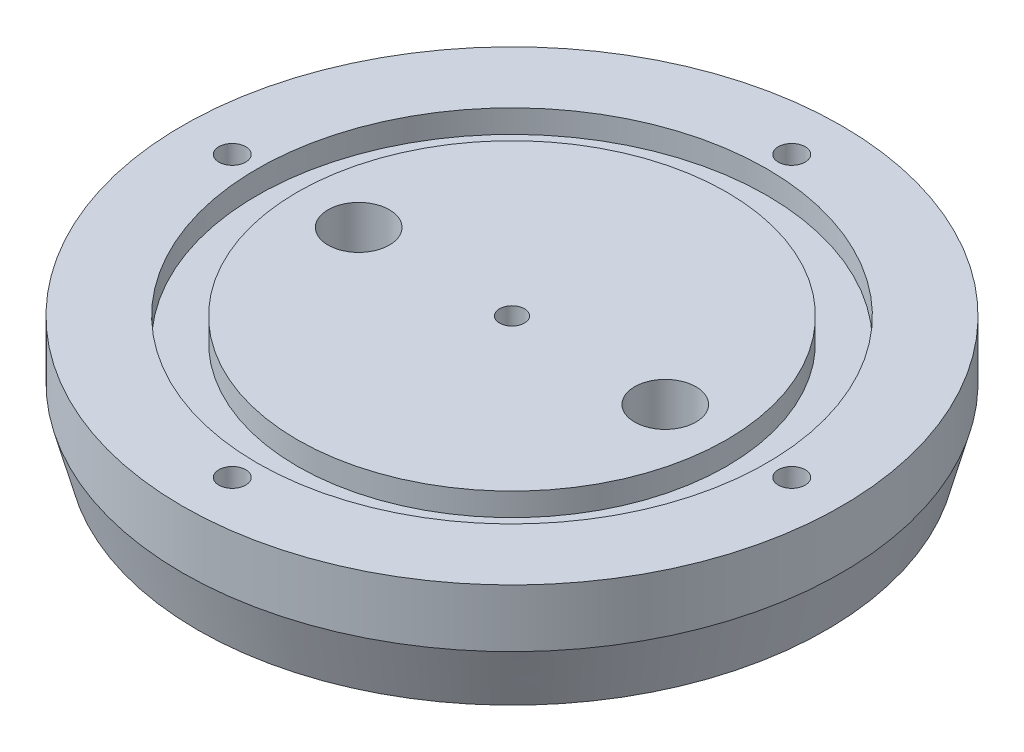
ISO-10303-21;
HEADER;
FILE_DESCRIPTION(('STEP AP214'),'2;1');
FILE_NAME('part.step','',(''),(''),'','','');
FILE_SCHEMA(('AUTOMOTIVE_DESIGN { 1 0 10303 214 1 1 1 1 }'));
ENDSEC;
DATA;
#1=APPLICATION_CONTEXT('core data for automotive mechanical design processes');
#2=APPLICATION_PROTOCOL_DEFINITION('international standard','automotive_design',2000,#1);
#3=PRODUCT_CONTEXT('',#1,'mechanical');
#4=PRODUCT('Part','Part','',(#3));
#5=PRODUCT_RELATED_PRODUCT_CATEGORY('part','',(#4));
#6=PRODUCT_DEFINITION_FORMATION('','',#4);
#7=PRODUCT_DEFINITION_CONTEXT('part definition',#1,'design');
#8=PRODUCT_DEFINITION('design','',#6,#7);
#9=PRODUCT_DEFINITION_SHAPE('','',#8);
#10=(LENGTH_UNIT() NAMED_UNIT(*) SI_UNIT(.MILLI.,.METRE.));
#11=(NAMED_UNIT(*) PLANE_ANGLE_UNIT() SI_UNIT($,.RADIAN.));
#12=(NAMED_UNIT(*) SI_UNIT($,.STERADIAN.) SOLID_ANGLE_UNIT());
#13=UNCERTAINTY_MEASURE_WITH_UNIT(LENGTH_MEASURE(1.E-05),#10,'distance_accuracy_value','');
#14=(GEOMETRIC_REPRESENTATION_CONTEXT(3) GLOBAL_UNCERTAINTY_ASSIGNED_CONTEXT((#13)) GLOBAL_UNIT_ASSIGNED_CONTEXT((#10,
#11,#12)) REPRESENTATION_CONTEXT('',''));
#15=CARTESIAN_POINT('',(0.,0.,0.));
#16=DIRECTION('',(0.,0.,1.));
#17=DIRECTION('',(1.,0.,0.));
#18=AXIS2_PLACEMENT_3D('',#15,#16,#17);
#19=CARTESIAN_POINT('',(0.,15.,0.));
#20=DIRECTION('',(0.,1.,0.));
#21=DIRECTION('',(0.,0.,1.));
#22=AXIS2_PLACEMENT_3D('',#19,#20,#21);
#23=PLANE('',#22);
#24=CARTESIAN_POINT('',(20.,15.,0.));
#25=DIRECTION('',(0.,-1.,0.));
#26=DIRECTION('',(0.,0.,-1.));
#27=AXIS2_PLACEMENT_3D('',#24,#25,#26);
#28=CIRCLE('',#27,4.);
#29=CARTESIAN_POINT('',(20.,15.,-4.));
#30=VERTEX_POINT('',#29);
#31=EDGE_CURVE('E66',#30,#30,#28,.T.);
#32=ORIENTED_EDGE('',*,*,#31,.T.);
#33=EDGE_LOOP('',(#32));
#34=FACE_BOUND('',#33,.T.);
#35=CARTESIAN_POINT('',(-20.,15.,0.));
#36=DIRECTION('',(0.,-1.,0.));
#37=DIRECTION('',(0.,0.,-1.));
#38=AXIS2_PLACEMENT_3D('',#35,#36,#37);
#39=CIRCLE('',#38,4.);
#40=CARTESIAN_POINT('',(-20.,15.,-4.));
#41=VERTEX_POINT('',#40);
#42=EDGE_CURVE('E69',#41,#41,#39,.T.);
#43=ORIENTED_EDGE('',*,*,#42,.T.);
#44=EDGE_LOOP('',(#43));
#45=FACE_BOUND('',#44,.T.);
#46=CARTESIAN_POINT('',(0.,15.,0.));
#47=DIRECTION('',(0.,1.,0.));
#48=DIRECTION('',(0.,0.,1.));
#49=AXIS2_PLACEMENT_3D('',#46,#47,#48);
#50=CIRCLE('',#49,1.625);
#51=CARTESIAN_POINT('',(0.,15.,1.625));
#52=VERTEX_POINT('',#51);
#53=EDGE_CURVE('E72',#52,#52,#50,.T.);
#54=ORIENTED_EDGE('',*,*,#53,.F.);
#55=EDGE_LOOP('',(#54));
#56=FACE_BOUND('',#55,.T.);
#57=CARTESIAN_POINT('',(0.,15.,0.));
#58=DIRECTION('',(0.,1.,0.));
#59=DIRECTION('',(0.,0.,1.));
#60=AXIS2_PLACEMENT_3D('',#57,#58,#59);
#61=CIRCLE('',#60,28.);
#62=CARTESIAN_POINT('',(0.,15.,28.));
#63=VERTEX_POINT('',#62);
#64=EDGE_CURVE('E82',#63,#63,#61,.T.);
#65=ORIENTED_EDGE('',*,*,#64,.T.);
#66=EDGE_LOOP('',(#65));
#67=FACE_BOUND('',#66,.T.);
#68=ADVANCED_FACE('F31',(#34,#45,#56,#67),#23,.T.);
#69=CARTESIAN_POINT('',(0.,15.,0.));
#70=DIRECTION('',(0.,-1.,0.));
#71=DIRECTION('',(0.,0.,-1.));
#72=AXIS2_PLACEMENT_3D('',#69,#70,#71);
#73=CYLINDRICAL_SURFACE('',#72,43.);
#74=CARTESIAN_POINT('',(0.,7.46410161513783,0.));
#75=DIRECTION('',(0.,1.,0.));
#76=DIRECTION('',(0.,0.,1.));
#77=AXIS2_PLACEMENT_3D('',#74,#75,#76);
#78=CIRCLE('',#77,43.);
#79=CARTESIAN_POINT('',(0.,7.46410161513783,43.));
#80=VERTEX_POINT('',#79);
#81=EDGE_CURVE('E60',#80,#80,#78,.T.);
#82=ORIENTED_EDGE('',*,*,#81,.T.);
#83=EDGE_LOOP('',(#82));
#84=FACE_BOUND('',#83,.T.);
#85=CARTESIAN_POINT('',(0.,15.,0.));
#86=DIRECTION('',(0.,1.,0.));
#87=DIRECTION('',(0.,0.,1.));
#88=AXIS2_PLACEMENT_3D('',#85,#86,#87);
#89=CIRCLE('',#88,43.);
#90=CARTESIAN_POINT('',(0.,15.,43.));
#91=VERTEX_POINT('',#90);
#92=EDGE_CURVE('E63',#91,#91,#89,.T.);
#93=ORIENTED_EDGE('',*,*,#92,.F.);
#94=EDGE_LOOP('',(#93));
#95=FACE_BOUND('',#94,.T.);
#96=ADVANCED_FACE('F152',(#84,#95),#73,.T.);
#97=CARTESIAN_POINT('',(-36.5,15.,0.));
#98=DIRECTION('',(0.,-1.,0.));
#99=DIRECTION('',(0.,0.,1.));
#100=AXIS2_PLACEMENT_3D('',#97,#98,#99);
#101=CIRCLE('',#100,1.75);
#102=CARTESIAN_POINT('',(-36.5,15.,1.75));
#103=VERTEX_POINT('',#102);
#104=EDGE_CURVE('E97',#103,#103,#101,.T.);
#105=ORIENTED_EDGE('',*,*,#104,.T.);
#106=EDGE_LOOP('',(#105));
#107=FACE_BOUND('',#106,.T.);
#108=CARTESIAN_POINT('',(3.82317206603323E-13,15.,-36.5));
#109=DIRECTION('',(0.,-1.,0.));
#110=DIRECTION('',(-1.,0.,0.));
#111=AXIS2_PLACEMENT_3D('',#108,#109,#110);
#112=CIRCLE('',#111,1.75);
#113=CARTESIAN_POINT('',(-1.74999999999962,15.,-36.5));
#114=VERTEX_POINT('',#113);
#115=EDGE_CURVE('E103',#114,#114,#112,.T.);
#116=ORIENTED_EDGE('',*,*,#115,.T.);
#117=EDGE_LOOP('',(#116));
#118=FACE_BOUND('',#117,.T.);
#119=CARTESIAN_POINT('',(-1.27439068867774E-13,15.,36.5));
#120=DIRECTION('',(0.,-1.,0.));
#121=DIRECTION('',(1.,0.,0.));
#122=AXIS2_PLACEMENT_3D('',#119,#120,#121);
#123=CIRCLE('',#122,1.75);
#124=CARTESIAN_POINT('',(1.74999999999988,15.,36.5));
#125=VERTEX_POINT('',#124);
#126=EDGE_CURVE('E91',#125,#125,#123,.T.);
#127=ORIENTED_EDGE('',*,*,#126,.T.);
#128=EDGE_LOOP('',(#127));
#129=FACE_BOUND('',#128,.T.);
#130=CARTESIAN_POINT('',(36.5,15.,0.));
#131=DIRECTION('',(0.,-1.,0.));
#132=DIRECTION('',(0.,0.,-1.));
#133=AXIS2_PLACEMENT_3D('',#130,#131,#132);
#134=CIRCLE('',#133,1.75);
#135=CARTESIAN_POINT('',(36.5,15.,-1.75));
#136=VERTEX_POINT('',#135);
#137=EDGE_CURVE('E85',#136,#136,#134,.T.);
#138=ORIENTED_EDGE('',*,*,#137,.T.);
#139=EDGE_LOOP('',(#138));
#140=FACE_BOUND('',#139,.T.);
#141=CARTESIAN_POINT('',(0.,15.,0.));
#142=DIRECTION('',(0.,1.,0.));
#143=DIRECTION('',(0.,0.,1.));
#144=AXIS2_PLACEMENT_3D('',#141,#142,#143);
#145=CIRCLE('',#144,33.25);
#146=CARTESIAN_POINT('',(0.,15.,33.25));
#147=VERTEX_POINT('',#146);
#148=EDGE_CURVE('E76',#147,#147,#145,.T.);
#149=ORIENTED_EDGE('',*,*,#148,.F.);
#150=EDGE_LOOP('',(#149));
#151=FACE_BOUND('',#150,.T.);
#152=ORIENTED_EDGE('',*,*,#92,.T.);
#153=EDGE_LOOP('',(#152));
#154=FACE_BOUND('',#153,.T.);
#155=ADVANCED_FACE('F112',(#107,#118,#129,#140,#151,#154),#23,.T.);
#156=CARTESIAN_POINT('',(0.,0.,0.));
#157=DIRECTION('',(0.,1.,0.));
#158=DIRECTION('',(0.,0.,1.));
#159=AXIS2_PLACEMENT_3D('',#156,#157,#158);
#160=PLANE('',#159);
#161=CARTESIAN_POINT('',(20.,0.,0.));
#162=DIRECTION('',(0.,1.,0.));
#163=DIRECTION('',(0.,0.,1.));
#164=AXIS2_PLACEMENT_3D('',#161,#162,#163);
#165=CIRCLE('',#164,4.49999999999998);
#166=CARTESIAN_POINT('',(20.,0.,4.49999999999998));
#167=VERTEX_POINT('',#166);
#168=EDGE_CURVE('E42',#167,#167,#165,.T.);
#169=ORIENTED_EDGE('',*,*,#168,.T.);
#170=EDGE_LOOP('',(#169));
#171=FACE_BOUND('',#170,.T.);
#172=CARTESIAN_POINT('',(0.,0.,0.));
#173=DIRECTION('',(0.,1.,0.));
#174=DIRECTION('',(0.,0.,1.));
#175=AXIS2_PLACEMENT_3D('',#172,#173,#174);
#176=CIRCLE('',#175,2.12499999999999);
#177=CARTESIAN_POINT('',(0.,0.,2.12499999999999));
#178=VERTEX_POINT('',#177);
#179=EDGE_CURVE('E46',#178,#178,#176,.T.);
#180=ORIENTED_EDGE('',*,*,#179,.T.);
#181=EDGE_LOOP('',(#180));
#182=FACE_BOUND('',#181,.T.);
#183=CARTESIAN_POINT('',(-20.,0.,0.));
#184=DIRECTION('',(0.,1.,0.));
#185=DIRECTION('',(0.,0.,1.));
#186=AXIS2_PLACEMENT_3D('',#183,#184,#185);
#187=CIRCLE('',#186,4.49999999999998);
#188=CARTESIAN_POINT('',(-20.,0.,4.49999999999998));
#189=VERTEX_POINT('',#188);
#190=EDGE_CURVE('E51',#189,#189,#187,.T.);
#191=ORIENTED_EDGE('',*,*,#190,.T.);
#192=EDGE_LOOP('',(#191));
#193=FACE_BOUND('',#192,.T.);
#194=CARTESIAN_POINT('',(0.,0.,0.));
#195=DIRECTION('',(0.,1.,0.));
#196=DIRECTION('',(0.,0.,1.));
#197=AXIS2_PLACEMENT_3D('',#194,#195,#196);
#198=CIRCLE('',#197,41.);
#199=CARTESIAN_POINT('',(0.,0.,41.));
#200=VERTEX_POINT('',#199);
#201=EDGE_CURVE('E57',#200,#200,#198,.F.);
#202=ORIENTED_EDGE('',*,*,#201,.T.);
#203=EDGE_LOOP('',(#202));
#204=FACE_BOUND('',#203,.T.);
#205=CARTESIAN_POINT('',(-36.5,0.,0.));
#206=DIRECTION('',(0.,-1.,0.));
#207=DIRECTION('',(0.,0.,1.));
#208=AXIS2_PLACEMENT_3D('',#205,#206,#207);
#209=CIRCLE('',#208,1.75);
#210=CARTESIAN_POINT('',(-36.5,0.,1.75));
#211=VERTEX_POINT('',#210);
#212=EDGE_CURVE('E106',#211,#211,#209,.T.);
#213=ORIENTED_EDGE('',*,*,#212,.F.);
#214=EDGE_LOOP('',(#213));
#215=FACE_BOUND('',#214,.T.);
#216=CARTESIAN_POINT('',(3.82317206603323E-13,0.,-36.5));
#217=DIRECTION('',(0.,-1.,0.));
#218=DIRECTION('',(-1.,0.,0.));
#219=AXIS2_PLACEMENT_3D('',#216,#217,#218);
#220=CIRCLE('',#219,1.75);
#221=CARTESIAN_POINT('',(-1.74999999999962,0.,-36.5));
#222=VERTEX_POINT('',#221);
#223=EDGE_CURVE('E100',#222,#222,#220,.T.);
#224=ORIENTED_EDGE('',*,*,#223,.F.);
#225=EDGE_LOOP('',(#224));
#226=FACE_BOUND('',#225,.T.);
#227=CARTESIAN_POINT('',(-1.27439068867774E-13,0.,36.5));
#228=DIRECTION('',(0.,-1.,0.));
#229=DIRECTION('',(1.,0.,0.));
#230=AXIS2_PLACEMENT_3D('',#227,#228,#229);
#231=CIRCLE('',#230,1.75);
#232=CARTESIAN_POINT('',(1.74999999999988,0.,36.5));
#233=VERTEX_POINT('',#232);
#234=EDGE_CURVE('E94',#233,#233,#231,.T.);
#235=ORIENTED_EDGE('',*,*,#234,.F.);
#236=EDGE_LOOP('',(#235));
#237=FACE_BOUND('',#236,.T.);
#238=CARTESIAN_POINT('',(36.5,0.,0.));
#239=DIRECTION('',(0.,-1.,0.));
#240=DIRECTION('',(0.,0.,-1.));
#241=AXIS2_PLACEMENT_3D('',#238,#239,#240);
#242=CIRCLE('',#241,1.75);
#243=CARTESIAN_POINT('',(36.5,0.,-1.75));
#244=VERTEX_POINT('',#243);
#245=EDGE_CURVE('E88',#244,#244,#242,.T.);
#246=ORIENTED_EDGE('',*,*,#245,.F.);
#247=EDGE_LOOP('',(#246));
#248=FACE_BOUND('',#247,.T.);
#249=ADVANCED_FACE('F123',(#171,#182,#193,#204,#215,#226,#237,#248),#160,.F.);
#250=CARTESIAN_POINT('',(20.,15.,0.));
#251=DIRECTION('',(0.,-1.,0.));
#252=DIRECTION('',(0.,0.,-1.));
#253=AXIS2_PLACEMENT_3D('',#250,#251,#252);
#254=CYLINDRICAL_SURFACE('',#253,4.);
#255=CARTESIAN_POINT('',(20.,0.499999999999962,0.));
#256=DIRECTION('',(0.,1.,0.));
#257=DIRECTION('',(0.,0.,1.));
#258=AXIS2_PLACEMENT_3D('',#255,#256,#257);
#259=CIRCLE('',#258,4.);
#260=CARTESIAN_POINT('',(20.,0.499999999999962,4.));
#261=VERTEX_POINT('',#260);
#262=EDGE_CURVE('E54',#261,#261,#259,.F.);
#263=ORIENTED_EDGE('',*,*,#262,.T.);
#264=EDGE_LOOP('',(#263));
#265=FACE_BOUND('',#264,.T.);
#266=ORIENTED_EDGE('',*,*,#31,.F.);
#267=EDGE_LOOP('',(#266));
#268=FACE_BOUND('',#267,.T.);
#269=ADVANCED_FACE('F126',(#265,#268),#254,.F.);
#270=CARTESIAN_POINT('',(-20.,15.,0.));
#271=DIRECTION('',(0.,-1.,0.));
#272=DIRECTION('',(0.,0.,-1.));
#273=AXIS2_PLACEMENT_3D('',#270,#271,#272);
#274=CYLINDRICAL_SURFACE('',#273,4.);
#275=CARTESIAN_POINT('',(-20.,0.499999999999962,0.));
#276=DIRECTION('',(0.,1.,0.));
#277=DIRECTION('',(0.,0.,1.));
#278=AXIS2_PLACEMENT_3D('',#275,#276,#277);
#279=CIRCLE('',#278,4.);
#280=CARTESIAN_POINT('',(-20.,0.499999999999962,4.));
#281=VERTEX_POINT('',#280);
#282=EDGE_CURVE('E10',#281,#281,#279,.F.);
#283=ORIENTED_EDGE('',*,*,#282,.T.);
#284=EDGE_LOOP('',(#283));
#285=FACE_BOUND('',#284,.T.);
#286=ORIENTED_EDGE('',*,*,#42,.F.);
#287=EDGE_LOOP('',(#286));
#288=FACE_BOUND('',#287,.T.);
#289=ADVANCED_FACE('F182',(#285,#288),#274,.F.);
#290=CARTESIAN_POINT('',(0.,0.,0.));
#291=DIRECTION('',(0.,1.,0.));
#292=DIRECTION('',(0.,0.,1.));
#293=AXIS2_PLACEMENT_3D('',#290,#291,#292);
#294=CYLINDRICAL_SURFACE('',#293,1.625);
#295=CARTESIAN_POINT('',(0.,0.499999999999983,0.));
#296=DIRECTION('',(0.,1.,0.));
#297=DIRECTION('',(0.,0.,1.));
#298=AXIS2_PLACEMENT_3D('',#295,#296,#297);
#299=CIRCLE('',#298,1.625);
#300=CARTESIAN_POINT('',(0.,0.499999999999983,1.625));
#301=VERTEX_POINT('',#300);
#302=EDGE_CURVE('E38',#301,#301,#299,.F.);
#303=ORIENTED_EDGE('',*,*,#302,.T.);
#304=EDGE_LOOP('',(#303));
#305=FACE_BOUND('',#304,.T.);
#306=ORIENTED_EDGE('',*,*,#53,.T.);
#307=EDGE_LOOP('',(#306));
#308=FACE_BOUND('',#307,.T.);
#309=ADVANCED_FACE('F191',(#305,#308),#294,.F.);
#310=CARTESIAN_POINT('',(0.,12.,0.));
#311=DIRECTION('',(0.,1.,0.));
#312=DIRECTION('',(0.,0.,1.));
#313=AXIS2_PLACEMENT_3D('',#310,#311,#312);
#314=CYLINDRICAL_SURFACE('',#313,33.25);
#315=CARTESIAN_POINT('',(0.,12.,0.));
#316=DIRECTION('',(0.,1.,0.));
#317=DIRECTION('',(0.,0.,1.));
#318=AXIS2_PLACEMENT_3D('',#315,#316,#317);
#319=CIRCLE('',#318,33.25);
#320=CARTESIAN_POINT('',(0.,12.,33.25));
#321=VERTEX_POINT('',#320);
#322=EDGE_CURVE('E75',#321,#321,#319,.T.);
#323=ORIENTED_EDGE('',*,*,#322,.F.);
#324=EDGE_LOOP('',(#323));
#325=FACE_BOUND('',#324,.T.);
#326=ORIENTED_EDGE('',*,*,#148,.T.);
#327=EDGE_LOOP('',(#326));
#328=FACE_BOUND('',#327,.T.);
#329=ADVANCED_FACE('F200',(#325,#328),#314,.F.);
#330=CARTESIAN_POINT('',(0.,12.,0.));
#331=DIRECTION('',(0.,1.,0.));
#332=DIRECTION('',(0.,0.,1.));
#333=AXIS2_PLACEMENT_3D('',#330,#331,#332);
#334=PLANE('',#333);
#335=CARTESIAN_POINT('',(0.,12.,0.));
#336=DIRECTION('',(0.,1.,0.));
#337=DIRECTION('',(0.,0.,1.));
#338=AXIS2_PLACEMENT_3D('',#335,#336,#337);
#339=CIRCLE('',#338,28.);
#340=CARTESIAN_POINT('',(0.,12.,28.));
#341=VERTEX_POINT('',#340);
#342=EDGE_CURVE('E79',#341,#341,#339,.T.);
#343=ORIENTED_EDGE('',*,*,#342,.F.);
#344=EDGE_LOOP('',(#343));
#345=FACE_BOUND('',#344,.T.);
#346=ORIENTED_EDGE('',*,*,#322,.T.);
#347=EDGE_LOOP('',(#346));
#348=FACE_BOUND('',#347,.T.);
#349=ADVANCED_FACE('F147',(#345,#348),#334,.T.);
#350=CARTESIAN_POINT('',(0.,12.,0.));
#351=DIRECTION('',(0.,1.,0.));
#352=DIRECTION('',(0.,0.,1.));
#353=AXIS2_PLACEMENT_3D('',#350,#351,#352);
#354=CYLINDRICAL_SURFACE('',#353,28.);
#355=ORIENTED_EDGE('',*,*,#342,.T.);
#356=EDGE_LOOP('',(#355));
#357=FACE_BOUND('',#356,.T.);
#358=ORIENTED_EDGE('',*,*,#64,.F.);
#359=EDGE_LOOP('',(#358));
#360=FACE_BOUND('',#359,.T.);
#361=ADVANCED_FACE('F138',(#357,#360),#354,.T.);
#362=CARTESIAN_POINT('',(36.5,15.,0.));
#363=DIRECTION('',(0.,-1.,0.));
#364=DIRECTION('',(0.,0.,-1.));
#365=AXIS2_PLACEMENT_3D('',#362,#363,#364);
#366=CYLINDRICAL_SURFACE('',#365,1.75);
#367=ORIENTED_EDGE('',*,*,#137,.F.);
#368=EDGE_LOOP('',(#367));
#369=FACE_BOUND('',#368,.T.);
#370=ORIENTED_EDGE('',*,*,#245,.T.);
#371=EDGE_LOOP('',(#370));
#372=FACE_BOUND('',#371,.T.);
#373=ADVANCED_FACE('F135',(#369,#372),#366,.F.);
#374=CARTESIAN_POINT('',(-1.27439068867774E-13,15.,36.5));
#375=DIRECTION('',(0.,-1.,0.));
#376=DIRECTION('',(0.,0.,-1.));
#377=AXIS2_PLACEMENT_3D('',#374,#375,#376);
#378=CYLINDRICAL_SURFACE('',#377,1.75);
#379=ORIENTED_EDGE('',*,*,#126,.F.);
#380=EDGE_LOOP('',(#379));
#381=FACE_BOUND('',#380,.T.);
#382=ORIENTED_EDGE('',*,*,#234,.T.);
#383=EDGE_LOOP('',(#382));
#384=FACE_BOUND('',#383,.T.);
#385=ADVANCED_FACE('F137',(#381,#384),#378,.F.);
#386=CARTESIAN_POINT('',(3.82317206603323E-13,15.,-36.5));
#387=DIRECTION('',(0.,-1.,0.));
#388=DIRECTION('',(0.,0.,-1.));
#389=AXIS2_PLACEMENT_3D('',#386,#387,#388);
#390=CYLINDRICAL_SURFACE('',#389,1.75);
#391=ORIENTED_EDGE('',*,*,#115,.F.);
#392=EDGE_LOOP('',(#391));
#393=FACE_BOUND('',#392,.T.);
#394=ORIENTED_EDGE('',*,*,#223,.T.);
#395=EDGE_LOOP('',(#394));
#396=FACE_BOUND('',#395,.T.);
#397=ADVANCED_FACE('F119',(#393,#396),#390,.F.);
#398=CARTESIAN_POINT('',(-36.5,15.,0.));
#399=DIRECTION('',(0.,-1.,0.));
#400=DIRECTION('',(0.,0.,-1.));
#401=AXIS2_PLACEMENT_3D('',#398,#399,#400);
#402=CYLINDRICAL_SURFACE('',#401,1.75);
#403=ORIENTED_EDGE('',*,*,#104,.F.);
#404=EDGE_LOOP('',(#403));
#405=FACE_BOUND('',#404,.T.);
#406=ORIENTED_EDGE('',*,*,#212,.T.);
#407=EDGE_LOOP('',(#406));
#408=FACE_BOUND('',#407,.T.);
#409=ADVANCED_FACE('F115',(#405,#408),#402,.F.);
#410=CARTESIAN_POINT('',(0.,7.46410161513783,0.));
#411=DIRECTION('',(0.,1.,0.));
#412=DIRECTION('',(0.,0.,1.));
#413=AXIS2_PLACEMENT_3D('',#410,#411,#412);
#414=CONICAL_SURFACE('',#413,43.,0.261799387799151);
#415=CARTESIAN_POINT('',(0.,0.,41.));
#416=CARTESIAN_POINT('',(0.,0.0777510584910182,41.0208333333333));
#417=CARTESIAN_POINT('',(0.,0.155502116982037,41.0416666666666));
#418=CARTESIAN_POINT('',(0.,0.311004233964075,41.0833333333333));
#419=CARTESIAN_POINT('',(0.,0.388755292455094,41.1041666666666));
#420=CARTESIAN_POINT('',(0.,0.544257409437133,41.1458333333333));
#421=CARTESIAN_POINT('',(0.,0.622008467928152,41.1666666666666));
#422=CARTESIAN_POINT('',(0.,0.77751058491019,41.2083333333333));
#423=CARTESIAN_POINT('',(0.,0.855261643401209,41.2291666666666));
#424=CARTESIAN_POINT('',(0.,1.01076376038325,41.2708333333333));
#425=CARTESIAN_POINT('',(0.,1.08851481887427,41.2916666666666));
#426=CARTESIAN_POINT('',(0.,1.2440169358563,41.3333333333333));
#427=CARTESIAN_POINT('',(0.,1.32176799434732,41.3541666666666));
#428=CARTESIAN_POINT('',(0.,1.47727011132936,41.3958333333333));
#429=CARTESIAN_POINT('',(0.,1.55502116982038,41.4166666666666));
#430=CARTESIAN_POINT('',(0.,1.71052328680242,41.4583333333333));
#431=CARTESIAN_POINT('',(0.,1.78827434529344,41.4791666666666));
#432=CARTESIAN_POINT('',(0.,1.94377646227548,41.5208333333333));
#433=CARTESIAN_POINT('',(0.,2.0215275207665,41.5416666666666));
#434=CARTESIAN_POINT('',(0.,2.17702963774853,41.5833333333333));
#435=CARTESIAN_POINT('',(0.,2.25478069623955,41.6041666666666));
#436=CARTESIAN_POINT('',(0.,2.41028281322159,41.6458333333333));
#437=CARTESIAN_POINT('',(0.,2.48803387171261,41.6666666666666));
#438=CARTESIAN_POINT('',(0.,2.64353598869465,41.7083333333333));
#439=CARTESIAN_POINT('',(0.,2.72128704718567,41.7291666666666));
#440=CARTESIAN_POINT('',(0.,2.8767891641677,41.7708333333333));
#441=CARTESIAN_POINT('',(0.,2.95454022265872,41.7916666666666));
#442=CARTESIAN_POINT('',(0.,3.11004233964076,41.8333333333333));
#443=CARTESIAN_POINT('',(0.,3.18779339813178,41.8541666666667));
#444=CARTESIAN_POINT('',(0.,3.34329551511382,41.8958333333333));
#445=CARTESIAN_POINT('',(0.,3.42104657360484,41.9166666666667));
#446=CARTESIAN_POINT('',(0.,3.57654869058688,41.9583333333333));
#447=CARTESIAN_POINT('',(0.,3.6542997490779,41.9791666666667));
#448=CARTESIAN_POINT('',(0.,3.80980186605993,42.0208333333333));
#449=CARTESIAN_POINT('',(0.,3.88755292455095,42.0416666666667));
#450=CARTESIAN_POINT('',(0.,4.04305504153299,42.0833333333333));
#451=CARTESIAN_POINT('',(0.,4.12080610002401,42.1041666666667));
#452=CARTESIAN_POINT('',(0.,4.27630821700605,42.1458333333333));
#453=CARTESIAN_POINT('',(0.,4.35405927549707,42.1666666666667));
#454=CARTESIAN_POINT('',(0.,4.50956139247911,42.2083333333333));
#455=CARTESIAN_POINT('',(0.,4.58731245097013,42.2291666666666));
#456=CARTESIAN_POINT('',(0.,4.74281456795216,42.2708333333333));
#457=CARTESIAN_POINT('',(0.,4.82056562644318,42.2916666666667));
#458=CARTESIAN_POINT('',(0.,4.97606774342522,42.3333333333333));
#459=CARTESIAN_POINT('',(0.,5.05381880191624,42.3541666666667));
#460=CARTESIAN_POINT('',(0.,5.20932091889828,42.3958333333333));
#461=CARTESIAN_POINT('',(0.,5.2870719773893,42.4166666666667));
#462=CARTESIAN_POINT('',(0.,5.44257409437133,42.4583333333333));
#463=CARTESIAN_POINT('',(0.,5.52032515286235,42.4791666666667));
#464=CARTESIAN_POINT('',(0.,5.67582726984439,42.5208333333333));
#465=CARTESIAN_POINT('',(0.,5.75357832833541,42.5416666666667));
#466=CARTESIAN_POINT('',(0.,5.90908044531745,42.5833333333333));
#467=CARTESIAN_POINT('',(0.,5.98683150380847,42.6041666666667));
#468=CARTESIAN_POINT('',(0.,6.14233362079051,42.6458333333333));
#469=CARTESIAN_POINT('',(0.,6.22008467928152,42.6666666666667));
#470=CARTESIAN_POINT('',(0.,6.37558679626356,42.7083333333333));
#471=CARTESIAN_POINT('',(0.,6.45333785475458,42.7291666666667));
#472=CARTESIAN_POINT('',(0.,6.60883997173662,42.7708333333333));
#473=CARTESIAN_POINT('',(0.,6.68659103022764,42.7916666666667));
#474=CARTESIAN_POINT('',(0.,6.84209314720968,42.8333333333333));
#475=CARTESIAN_POINT('',(0.,6.9198442057007,42.8541666666667));
#476=CARTESIAN_POINT('',(0.,7.07534632268273,42.8958333333333));
#477=CARTESIAN_POINT('',(0.,7.15309738117375,42.9166666666667));
#478=CARTESIAN_POINT('',(0.,7.30859949815579,42.9583333333333));
#479=CARTESIAN_POINT('',(0.,7.38635055664681,42.9791666666667));
#480=CARTESIAN_POINT('',(0.,7.46410161513783,43.));
#481=B_SPLINE_CURVE_WITH_KNOTS('',3,(#415,#416,#417,#418,#419,#420,#421,#422,#423,#424,#425,
#426,#427,#428,#429,#430,#431,#432,#433,#434,#435,#436,#437,#438,#439,#440,#441,#442,#443,#444,
#445,#446,#447,#448,#449,#450,#451,#452,#453,#454,#455,#456,#457,#458,#459,#460,#461,#462,#463,
#464,#465,#466,#467,#468,#469,#470,#471,#472,#473,#474,#475,#476,#477,#478,#479,#480),
.UNSPECIFIED.,.F.,.F.,(4,2,2,2,2,2,2,2,2,2,2,2,2,2,2,2,2,2,2,2,2,2,2,2,2,2,2,2,2,2,2,2,4),(0.,
0.241481456572269,0.482962913144539,0.724444369716808,0.965925826289078,1.20740728286135,
1.44888873943362,1.69037019600589,1.93185165257816,2.17333310915043,2.4148145657227,
2.65629602229497,2.89777747886723,3.13925893543951,3.38074039201178,3.62222184858405,
3.86370330515631,4.10518476172859,4.34666621830085,4.58814767487312,4.82962913144539,
5.07111058801766,5.31259204458993,5.5540735011622,5.79555495773447,6.03703641430674,
6.27851787087901,6.51999932745128,6.76148078402355,7.00296224059582,7.24444369716809,
7.48592515374036,7.72740661031263),.UNSPECIFIED.);
#482=EDGE_CURVE('BSEAM118',#200,#80,#481,.T.);
#483=ORIENTED_EDGE('',*,*,#201,.F.);
#484=ORIENTED_EDGE('',*,*,#81,.F.);
#485=ORIENTED_EDGE('',*,*,#482,.T.);
#486=ORIENTED_EDGE('',*,*,#482,.F.);
#487=EDGE_LOOP('',(#483,#485,#484,#486));
#488=FACE_BOUND('',#487,.T.);
#489=ADVANCED_FACE('F118',(#488),#414,.T.);
#490=CARTESIAN_POINT('',(20.,0.499999999999962,0.));
#491=DIRECTION('',(0.,-1.,0.));
#492=DIRECTION('',(0.,0.,-1.));
#493=AXIS2_PLACEMENT_3D('',#490,#491,#492);
#494=CONICAL_SURFACE('',#493,4.,0.785398163397463);
#495=ORIENTED_EDGE('',*,*,#168,.F.);
#496=EDGE_LOOP('',(#495));
#497=FACE_BOUND('',#496,.T.);
#498=ORIENTED_EDGE('',*,*,#262,.F.);
#499=EDGE_LOOP('',(#498));
#500=FACE_BOUND('',#499,.T.);
#501=ADVANCED_FACE('F252',(#497,#500),#494,.F.);
#502=CARTESIAN_POINT('',(0.,0.,0.));
#503=DIRECTION('',(0.,-1.,0.));
#504=DIRECTION('',(0.,0.,-1.));
#505=AXIS2_PLACEMENT_3D('',#502,#503,#504);
#506=CONICAL_SURFACE('',#505,2.12499999999999,0.785398163397454);
#507=ORIENTED_EDGE('',*,*,#302,.F.);
#508=EDGE_LOOP('',(#507));
#509=FACE_BOUND('',#508,.T.);
#510=ORIENTED_EDGE('',*,*,#179,.F.);
#511=EDGE_LOOP('',(#510));
#512=FACE_BOUND('',#511,.T.);
#513=ADVANCED_FACE('F260',(#509,#512),#506,.F.);
#514=CARTESIAN_POINT('',(-20.,0.499999999999962,0.));
#515=DIRECTION('',(0.,-1.,0.));
#516=DIRECTION('',(0.,0.,-1.));
#517=AXIS2_PLACEMENT_3D('',#514,#515,#516);
#518=CONICAL_SURFACE('',#517,4.,0.785398163397463);
#519=ORIENTED_EDGE('',*,*,#190,.F.);
#520=EDGE_LOOP('',(#519));
#521=FACE_BOUND('',#520,.T.);
#522=ORIENTED_EDGE('',*,*,#282,.F.);
#523=EDGE_LOOP('',(#522));
#524=FACE_BOUND('',#523,.T.);
#525=ADVANCED_FACE('F33',(#521,#524),#518,.F.);
#526=CLOSED_SHELL('',(#68,#96,#155,#249,#269,#289,#309,#329,#349,#361,#373,#385,#397,#409,#489,
#501,#513,#525));
#527=MANIFOLD_SOLID_BREP('B2',#526);
#528=ADVANCED_BREP_SHAPE_REPRESENTATION('',(#18,#527),#14);
#529=SHAPE_DEFINITION_REPRESENTATION(#9,#528);
ENDSEC;
END-ISO-10303-21;
